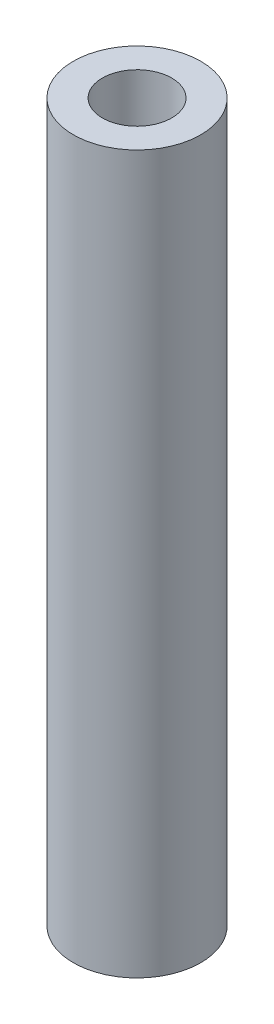
ISO-10303-21;
HEADER;
FILE_DESCRIPTION(('STEP AP214'),'2;1');
FILE_NAME('part.step','',(''),(''),'','','');
FILE_SCHEMA(('AUTOMOTIVE_DESIGN { 1 0 10303 214 1 1 1 1 }'));
ENDSEC;
DATA;
#1=APPLICATION_CONTEXT('core data for automotive mechanical design processes');
#2=APPLICATION_PROTOCOL_DEFINITION('international standard','automotive_design',2000,#1);
#3=PRODUCT_CONTEXT('',#1,'mechanical');
#4=PRODUCT('Part','Part','',(#3));
#5=PRODUCT_RELATED_PRODUCT_CATEGORY('part','',(#4));
#6=PRODUCT_DEFINITION_FORMATION('','',#4);
#7=PRODUCT_DEFINITION_CONTEXT('part definition',#1,'design');
#8=PRODUCT_DEFINITION('design','',#6,#7);
#9=PRODUCT_DEFINITION_SHAPE('','',#8);
#10=(LENGTH_UNIT() NAMED_UNIT(*) SI_UNIT(.MILLI.,.METRE.));
#11=(NAMED_UNIT(*) PLANE_ANGLE_UNIT() SI_UNIT($,.RADIAN.));
#12=(NAMED_UNIT(*) SI_UNIT($,.STERADIAN.) SOLID_ANGLE_UNIT());
#13=UNCERTAINTY_MEASURE_WITH_UNIT(LENGTH_MEASURE(1.E-05),#10,'distance_accuracy_value','');
#14=(GEOMETRIC_REPRESENTATION_CONTEXT(3) GLOBAL_UNCERTAINTY_ASSIGNED_CONTEXT((#13)) GLOBAL_UNIT_ASSIGNED_CONTEXT((#10,
#11,#12)) REPRESENTATION_CONTEXT('',''));
#15=CARTESIAN_POINT('',(0.,0.,0.));
#16=DIRECTION('',(0.,0.,1.));
#17=DIRECTION('',(1.,0.,0.));
#18=AXIS2_PLACEMENT_3D('',#15,#16,#17);
#19=CARTESIAN_POINT('',(0.,45.,0.));
#20=DIRECTION('',(0.,1.,0.));
#21=DIRECTION('',(0.,0.,1.));
#22=AXIS2_PLACEMENT_3D('',#19,#20,#21);
#23=PLANE('',#22);
#24=CARTESIAN_POINT('',(0.,45.,0.));
#25=DIRECTION('',(0.,1.,0.));
#26=DIRECTION('',(0.,0.,1.));
#27=AXIS2_PLACEMENT_3D('',#24,#25,#26);
#28=CIRCLE('',#27,4.);
#29=CARTESIAN_POINT('',(0.,45.,-4.));
#30=VERTEX_POINT('',#29);
#31=EDGE_CURVE('E10',#30,#30,#28,.T.);
#32=ORIENTED_EDGE('',*,*,#31,.T.);
#33=EDGE_LOOP('',(#32));
#34=FACE_BOUND('',#33,.T.);
#35=CARTESIAN_POINT('',(0.,45.,0.));
#36=DIRECTION('',(0.,1.,0.));
#37=DIRECTION('',(0.,0.,1.));
#38=AXIS2_PLACEMENT_3D('',#35,#36,#37);
#39=CIRCLE('',#38,2.175);
#40=CARTESIAN_POINT('',(0.,45.,-2.175));
#41=VERTEX_POINT('',#40);
#42=EDGE_CURVE('E42',#41,#41,#39,.T.);
#43=ORIENTED_EDGE('',*,*,#42,.F.);
#44=EDGE_LOOP('',(#43));
#45=FACE_BOUND('',#44,.T.);
#46=ADVANCED_FACE('F31',(#34,#45),#23,.T.);
#47=CARTESIAN_POINT('',(0.,0.,0.));
#48=DIRECTION('',(0.,1.,0.));
#49=DIRECTION('',(0.,0.,1.));
#50=AXIS2_PLACEMENT_3D('',#47,#48,#49);
#51=PLANE('',#50);
#52=CARTESIAN_POINT('',(0.,0.,0.));
#53=DIRECTION('',(0.,1.,0.));
#54=DIRECTION('',(0.,0.,1.));
#55=AXIS2_PLACEMENT_3D('',#52,#53,#54);
#56=CIRCLE('',#55,4.);
#57=CARTESIAN_POINT('',(0.,0.,-4.));
#58=VERTEX_POINT('',#57);
#59=EDGE_CURVE('E35',#58,#58,#56,.T.);
#60=ORIENTED_EDGE('',*,*,#59,.F.);
#61=EDGE_LOOP('',(#60));
#62=FACE_BOUND('',#61,.T.);
#63=CARTESIAN_POINT('',(0.,0.,0.));
#64=DIRECTION('',(0.,1.,0.));
#65=DIRECTION('',(0.,0.,1.));
#66=AXIS2_PLACEMENT_3D('',#63,#64,#65);
#67=CIRCLE('',#66,2.175);
#68=CARTESIAN_POINT('',(0.,0.,-2.175));
#69=VERTEX_POINT('',#68);
#70=EDGE_CURVE('E44',#69,#69,#67,.T.);
#71=ORIENTED_EDGE('',*,*,#70,.T.);
#72=EDGE_LOOP('',(#71));
#73=FACE_BOUND('',#72,.T.);
#74=ADVANCED_FACE('F54',(#62,#73),#51,.F.);
#75=CARTESIAN_POINT('',(0.,45.,0.));
#76=DIRECTION('',(0.,-1.,0.));
#77=DIRECTION('',(0.,0.,-1.));
#78=AXIS2_PLACEMENT_3D('',#75,#76,#77);
#79=CYLINDRICAL_SURFACE('',#78,4.);
#80=CARTESIAN_POINT('',(0.,45.,-4.));
#81=CARTESIAN_POINT('',(0.,44.53125,-4.));
#82=CARTESIAN_POINT('',(0.,44.0625,-4.));
#83=CARTESIAN_POINT('',(0.,43.125,-4.));
#84=CARTESIAN_POINT('',(0.,42.65625,-4.));
#85=CARTESIAN_POINT('',(0.,41.71875,-4.));
#86=CARTESIAN_POINT('',(0.,41.25,-4.));
#87=CARTESIAN_POINT('',(0.,40.3125,-4.));
#88=CARTESIAN_POINT('',(0.,39.84375,-4.));
#89=CARTESIAN_POINT('',(0.,38.90625,-4.));
#90=CARTESIAN_POINT('',(0.,38.4375,-4.));
#91=CARTESIAN_POINT('',(0.,37.5,-4.));
#92=CARTESIAN_POINT('',(0.,37.03125,-4.));
#93=CARTESIAN_POINT('',(0.,36.09375,-4.));
#94=CARTESIAN_POINT('',(0.,35.625,-4.));
#95=CARTESIAN_POINT('',(0.,34.6875,-4.));
#96=CARTESIAN_POINT('',(0.,34.21875,-4.));
#97=CARTESIAN_POINT('',(0.,33.28125,-4.));
#98=CARTESIAN_POINT('',(0.,32.8125,-4.));
#99=CARTESIAN_POINT('',(0.,31.875,-4.));
#100=CARTESIAN_POINT('',(0.,31.40625,-4.));
#101=CARTESIAN_POINT('',(0.,30.46875,-4.));
#102=CARTESIAN_POINT('',(0.,30.,-4.));
#103=CARTESIAN_POINT('',(0.,29.0625,-4.));
#104=CARTESIAN_POINT('',(0.,28.59375,-4.));
#105=CARTESIAN_POINT('',(0.,27.65625,-4.));
#106=CARTESIAN_POINT('',(0.,27.1875,-4.));
#107=CARTESIAN_POINT('',(0.,26.25,-4.));
#108=CARTESIAN_POINT('',(0.,25.78125,-4.));
#109=CARTESIAN_POINT('',(0.,24.84375,-4.));
#110=CARTESIAN_POINT('',(0.,24.375,-4.));
#111=CARTESIAN_POINT('',(0.,23.4375,-4.));
#112=CARTESIAN_POINT('',(0.,22.96875,-4.));
#113=CARTESIAN_POINT('',(0.,22.03125,-4.));
#114=CARTESIAN_POINT('',(0.,21.5625,-4.));
#115=CARTESIAN_POINT('',(0.,20.625,-4.));
#116=CARTESIAN_POINT('',(0.,20.15625,-4.));
#117=CARTESIAN_POINT('',(0.,19.21875,-4.));
#118=CARTESIAN_POINT('',(0.,18.75,-4.));
#119=CARTESIAN_POINT('',(0.,17.8125,-4.));
#120=CARTESIAN_POINT('',(0.,17.34375,-4.));
#121=CARTESIAN_POINT('',(0.,16.40625,-4.));
#122=CARTESIAN_POINT('',(0.,15.9375,-4.));
#123=CARTESIAN_POINT('',(0.,15.,-4.));
#124=CARTESIAN_POINT('',(0.,14.53125,-4.));
#125=CARTESIAN_POINT('',(0.,13.59375,-4.));
#126=CARTESIAN_POINT('',(0.,13.125,-4.));
#127=CARTESIAN_POINT('',(0.,12.1875,-4.));
#128=CARTESIAN_POINT('',(0.,11.71875,-4.));
#129=CARTESIAN_POINT('',(0.,10.78125,-4.));
#130=CARTESIAN_POINT('',(0.,10.3125,-4.));
#131=CARTESIAN_POINT('',(0.,9.37499999999999,-4.));
#132=CARTESIAN_POINT('',(0.,8.90624999999999,-4.));
#133=CARTESIAN_POINT('',(0.,7.96874999999999,-4.));
#134=CARTESIAN_POINT('',(0.,7.5,-4.));
#135=CARTESIAN_POINT('',(0.,6.56249999999999,-4.));
#136=CARTESIAN_POINT('',(0.,6.09374999999999,-4.));
#137=CARTESIAN_POINT('',(0.,5.15624999999999,-4.));
#138=CARTESIAN_POINT('',(0.,4.68749999999999,-4.));
#139=CARTESIAN_POINT('',(0.,3.74999999999999,-4.));
#140=CARTESIAN_POINT('',(0.,3.28124999999999,-4.));
#141=CARTESIAN_POINT('',(0.,2.34374999999999,-4.));
#142=CARTESIAN_POINT('',(0.,1.87499999999999,-4.));
#143=CARTESIAN_POINT('',(0.,0.937499999999992,-4.));
#144=CARTESIAN_POINT('',(0.,0.468749999999993,-4.));
#145=CARTESIAN_POINT('',(0.,0.,-4.));
#146=B_SPLINE_CURVE_WITH_KNOTS('',3,(#80,#81,#82,#83,#84,#85,#86,#87,#88,#89,#90,#91,#92,#93,
#94,#95,#96,#97,#98,#99,#100,#101,#102,#103,#104,#105,#106,#107,#108,#109,#110,#111,#112,#113,
#114,#115,#116,#117,#118,#119,#120,#121,#122,#123,#124,#125,#126,#127,#128,#129,#130,#131,#132,
#133,#134,#135,#136,#137,#138,#139,#140,#141,#142,#143,#144,#145),.UNSPECIFIED.,.F.,.F.,(4,2,2,
2,2,2,2,2,2,2,2,2,2,2,2,2,2,2,2,2,2,2,2,2,2,2,2,2,2,2,2,2,4),(0.,1.40625,2.8125,
4.21874999999999,5.625,7.03125,8.43749999999999,9.84375,11.25,12.65625,14.0625,15.46875,16.875,
18.28125,19.6875,21.09375,22.5,23.90625,25.3125,26.71875,28.125,29.53125,30.9375,32.34375,33.75,
35.15625,36.5625,37.96875,39.375,40.78125,42.1875,43.59375,45.),.UNSPECIFIED.);
#147=EDGE_CURVE('BSEAM33',#30,#58,#146,.T.);
#148=ORIENTED_EDGE('',*,*,#31,.F.);
#149=ORIENTED_EDGE('',*,*,#59,.T.);
#150=ORIENTED_EDGE('',*,*,#147,.T.);
#151=ORIENTED_EDGE('',*,*,#147,.F.);
#152=EDGE_LOOP('',(#148,#150,#149,#151));
#153=FACE_BOUND('',#152,.T.);
#154=ADVANCED_FACE('F33',(#153),#79,.T.);
#155=CARTESIAN_POINT('',(0.,45.,0.));
#156=DIRECTION('',(0.,-1.,0.));
#157=DIRECTION('',(0.,0.,-1.));
#158=AXIS2_PLACEMENT_3D('',#155,#156,#157);
#159=CYLINDRICAL_SURFACE('',#158,2.175);
#160=CARTESIAN_POINT('',(0.,45.,-2.175));
#161=CARTESIAN_POINT('',(0.,44.53125,-2.175));
#162=CARTESIAN_POINT('',(0.,44.0625,-2.175));
#163=CARTESIAN_POINT('',(0.,43.125,-2.175));
#164=CARTESIAN_POINT('',(0.,42.65625,-2.175));
#165=CARTESIAN_POINT('',(0.,41.71875,-2.175));
#166=CARTESIAN_POINT('',(0.,41.25,-2.175));
#167=CARTESIAN_POINT('',(0.,40.3125,-2.175));
#168=CARTESIAN_POINT('',(0.,39.84375,-2.175));
#169=CARTESIAN_POINT('',(0.,38.90625,-2.175));
#170=CARTESIAN_POINT('',(0.,38.4375,-2.175));
#171=CARTESIAN_POINT('',(0.,37.5,-2.175));
#172=CARTESIAN_POINT('',(0.,37.03125,-2.175));
#173=CARTESIAN_POINT('',(0.,36.09375,-2.175));
#174=CARTESIAN_POINT('',(0.,35.625,-2.175));
#175=CARTESIAN_POINT('',(0.,34.6875,-2.175));
#176=CARTESIAN_POINT('',(0.,34.21875,-2.175));
#177=CARTESIAN_POINT('',(0.,33.28125,-2.175));
#178=CARTESIAN_POINT('',(0.,32.8125,-2.175));
#179=CARTESIAN_POINT('',(0.,31.875,-2.175));
#180=CARTESIAN_POINT('',(0.,31.40625,-2.175));
#181=CARTESIAN_POINT('',(0.,30.46875,-2.175));
#182=CARTESIAN_POINT('',(0.,30.,-2.175));
#183=CARTESIAN_POINT('',(0.,29.0625,-2.175));
#184=CARTESIAN_POINT('',(0.,28.59375,-2.175));
#185=CARTESIAN_POINT('',(0.,27.65625,-2.175));
#186=CARTESIAN_POINT('',(0.,27.1875,-2.175));
#187=CARTESIAN_POINT('',(0.,26.25,-2.175));
#188=CARTESIAN_POINT('',(0.,25.78125,-2.175));
#189=CARTESIAN_POINT('',(0.,24.84375,-2.175));
#190=CARTESIAN_POINT('',(0.,24.375,-2.175));
#191=CARTESIAN_POINT('',(0.,23.4375,-2.175));
#192=CARTESIAN_POINT('',(0.,22.96875,-2.175));
#193=CARTESIAN_POINT('',(0.,22.03125,-2.175));
#194=CARTESIAN_POINT('',(0.,21.5625,-2.175));
#195=CARTESIAN_POINT('',(0.,20.625,-2.175));
#196=CARTESIAN_POINT('',(0.,20.15625,-2.175));
#197=CARTESIAN_POINT('',(0.,19.21875,-2.175));
#198=CARTESIAN_POINT('',(0.,18.75,-2.175));
#199=CARTESIAN_POINT('',(0.,17.8125,-2.175));
#200=CARTESIAN_POINT('',(0.,17.34375,-2.175));
#201=CARTESIAN_POINT('',(0.,16.40625,-2.175));
#202=CARTESIAN_POINT('',(0.,15.9375,-2.175));
#203=CARTESIAN_POINT('',(0.,15.,-2.175));
#204=CARTESIAN_POINT('',(0.,14.53125,-2.175));
#205=CARTESIAN_POINT('',(0.,13.59375,-2.175));
#206=CARTESIAN_POINT('',(0.,13.125,-2.175));
#207=CARTESIAN_POINT('',(0.,12.1875,-2.175));
#208=CARTESIAN_POINT('',(0.,11.71875,-2.175));
#209=CARTESIAN_POINT('',(0.,10.78125,-2.175));
#210=CARTESIAN_POINT('',(0.,10.3125,-2.175));
#211=CARTESIAN_POINT('',(0.,9.37499999999999,-2.175));
#212=CARTESIAN_POINT('',(0.,8.90624999999999,-2.175));
#213=CARTESIAN_POINT('',(0.,7.96874999999999,-2.175));
#214=CARTESIAN_POINT('',(0.,7.5,-2.175));
#215=CARTESIAN_POINT('',(0.,6.56249999999999,-2.175));
#216=CARTESIAN_POINT('',(0.,6.09374999999999,-2.175));
#217=CARTESIAN_POINT('',(0.,5.15624999999999,-2.175));
#218=CARTESIAN_POINT('',(0.,4.68749999999999,-2.175));
#219=CARTESIAN_POINT('',(0.,3.74999999999999,-2.175));
#220=CARTESIAN_POINT('',(0.,3.28124999999999,-2.175));
#221=CARTESIAN_POINT('',(0.,2.34374999999999,-2.175));
#222=CARTESIAN_POINT('',(0.,1.87499999999999,-2.175));
#223=CARTESIAN_POINT('',(0.,0.937499999999992,-2.175));
#224=CARTESIAN_POINT('',(0.,0.468749999999993,-2.175));
#225=CARTESIAN_POINT('',(0.,0.,-2.175));
#226=B_SPLINE_CURVE_WITH_KNOTS('',3,(#160,#161,#162,#163,#164,#165,#166,#167,#168,#169,#170,
#171,#172,#173,#174,#175,#176,#177,#178,#179,#180,#181,#182,#183,#184,#185,#186,#187,#188,#189,
#190,#191,#192,#193,#194,#195,#196,#197,#198,#199,#200,#201,#202,#203,#204,#205,#206,#207,#208,
#209,#210,#211,#212,#213,#214,#215,#216,#217,#218,#219,#220,#221,#222,#223,#224,#225),
.UNSPECIFIED.,.F.,.F.,(4,2,2,2,2,2,2,2,2,2,2,2,2,2,2,2,2,2,2,2,2,2,2,2,2,2,2,2,2,2,2,2,4),(0.,
1.40625,2.8125,4.21874999999999,5.625,7.03125,8.43749999999999,9.84375,11.25,12.65625,14.0625,
15.46875,16.875,18.28125,19.6875,21.09375,22.5,23.90625,25.3125,26.71875,28.125,29.53125,
30.9375,32.34375,33.75,35.15625,36.5625,37.96875,39.375,40.78125,42.1875,43.59375,45.),.UNSPECIFIED.);
#227=EDGE_CURVE('BSEAM50',#41,#69,#226,.T.);
#228=ORIENTED_EDGE('',*,*,#42,.T.);
#229=ORIENTED_EDGE('',*,*,#70,.F.);
#230=ORIENTED_EDGE('',*,*,#227,.T.);
#231=ORIENTED_EDGE('',*,*,#227,.F.);
#232=EDGE_LOOP('',(#228,#230,#229,#231));
#233=FACE_BOUND('',#232,.T.);
#234=ADVANCED_FACE('F50',(#233),#159,.F.);
#235=CLOSED_SHELL('',(#46,#74,#154,#234));
#236=MANIFOLD_SOLID_BREP('B2',#235);
#237=ADVANCED_BREP_SHAPE_REPRESENTATION('',(#18,#236),#14);
#238=SHAPE_DEFINITION_REPRESENTATION(#9,#237);
ENDSEC;
END-ISO-10303-21;
